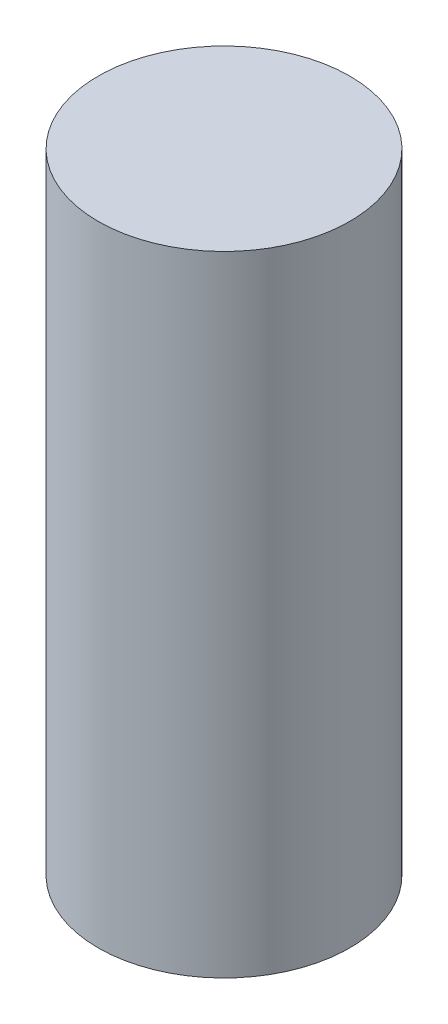
ISO-10303-21;
HEADER;
FILE_DESCRIPTION(('STEP AP214'),'2;1');
FILE_NAME('part.step','',(''),(''),'','','');
FILE_SCHEMA(('AUTOMOTIVE_DESIGN { 1 0 10303 214 1 1 1 1 }'));
ENDSEC;
DATA;
#1=APPLICATION_CONTEXT('core data for automotive mechanical design processes');
#2=APPLICATION_PROTOCOL_DEFINITION('international standard','automotive_design',2000,#1);
#3=PRODUCT_CONTEXT('',#1,'mechanical');
#4=PRODUCT('Part','Part','',(#3));
#5=PRODUCT_RELATED_PRODUCT_CATEGORY('part','',(#4));
#6=PRODUCT_DEFINITION_FORMATION('','',#4);
#7=PRODUCT_DEFINITION_CONTEXT('part definition',#1,'design');
#8=PRODUCT_DEFINITION('design','',#6,#7);
#9=PRODUCT_DEFINITION_SHAPE('','',#8);
#10=(LENGTH_UNIT() NAMED_UNIT(*) SI_UNIT(.MILLI.,.METRE.));
#11=(NAMED_UNIT(*) PLANE_ANGLE_UNIT() SI_UNIT($,.RADIAN.));
#12=(NAMED_UNIT(*) SI_UNIT($,.STERADIAN.) SOLID_ANGLE_UNIT());
#13=UNCERTAINTY_MEASURE_WITH_UNIT(LENGTH_MEASURE(1.E-05),#10,'distance_accuracy_value','');
#14=(GEOMETRIC_REPRESENTATION_CONTEXT(3) GLOBAL_UNCERTAINTY_ASSIGNED_CONTEXT((#13)) GLOBAL_UNIT_ASSIGNED_CONTEXT((#10,
#11,#12)) REPRESENTATION_CONTEXT('',''));
#15=CARTESIAN_POINT('',(0.,0.,0.));
#16=DIRECTION('',(0.,0.,1.));
#17=DIRECTION('',(1.,0.,0.));
#18=AXIS2_PLACEMENT_3D('',#15,#16,#17);
#19=CARTESIAN_POINT('',(0.,100.,0.));
#20=DIRECTION('',(0.,-1.,0.));
#21=DIRECTION('',(0.,0.,-1.));
#22=AXIS2_PLACEMENT_3D('',#19,#20,#21);
#23=CYLINDRICAL_SURFACE('',#22,20.);
#24=CARTESIAN_POINT('',(0.,100.,0.));
#25=DIRECTION('',(0.,1.,0.));
#26=DIRECTION('',(0.,0.,1.));
#27=AXIS2_PLACEMENT_3D('',#24,#25,#26);
#28=CIRCLE('',#27,20.);
#29=CARTESIAN_POINT('',(0.,100.,20.));
#30=VERTEX_POINT('',#29);
#31=EDGE_CURVE('E10',#30,#30,#28,.T.);
#32=ORIENTED_EDGE('',*,*,#31,.F.);
#33=EDGE_LOOP('',(#32));
#34=FACE_BOUND('',#33,.T.);
#35=CARTESIAN_POINT('',(0.,0.,0.));
#36=DIRECTION('',(0.,1.,0.));
#37=DIRECTION('',(0.,0.,1.));
#38=AXIS2_PLACEMENT_3D('',#35,#36,#37);
#39=CIRCLE('',#38,20.);
#40=CARTESIAN_POINT('',(0.,0.,20.));
#41=VERTEX_POINT('',#40);
#42=EDGE_CURVE('E33',#41,#41,#39,.T.);
#43=ORIENTED_EDGE('',*,*,#42,.T.);
#44=EDGE_LOOP('',(#43));
#45=FACE_BOUND('',#44,.T.);
#46=ADVANCED_FACE('F30',(#34,#45),#23,.T.);
#47=CARTESIAN_POINT('',(0.,100.,0.));
#48=DIRECTION('',(0.,1.,0.));
#49=DIRECTION('',(0.,0.,1.));
#50=AXIS2_PLACEMENT_3D('',#47,#48,#49);
#51=PLANE('',#50);
#52=ORIENTED_EDGE('',*,*,#31,.T.);
#53=EDGE_LOOP('',(#52));
#54=FACE_BOUND('',#53,.T.);
#55=ADVANCED_FACE('F45',(#54),#51,.T.);
#56=CARTESIAN_POINT('',(0.,0.,0.));
#57=DIRECTION('',(0.,1.,0.));
#58=DIRECTION('',(0.,0.,1.));
#59=AXIS2_PLACEMENT_3D('',#56,#57,#58);
#60=PLANE('',#59);
#61=ORIENTED_EDGE('',*,*,#42,.F.);
#62=EDGE_LOOP('',(#61));
#63=FACE_BOUND('',#62,.T.);
#64=ADVANCED_FACE('F43',(#63),#60,.F.);
#65=CLOSED_SHELL('',(#46,#55,#64));
#66=MANIFOLD_SOLID_BREP('B2',#65);
#67=ADVANCED_BREP_SHAPE_REPRESENTATION('',(#18,#66),#14);
#68=SHAPE_DEFINITION_REPRESENTATION(#9,#67);
ENDSEC;
END-ISO-10303-21;
